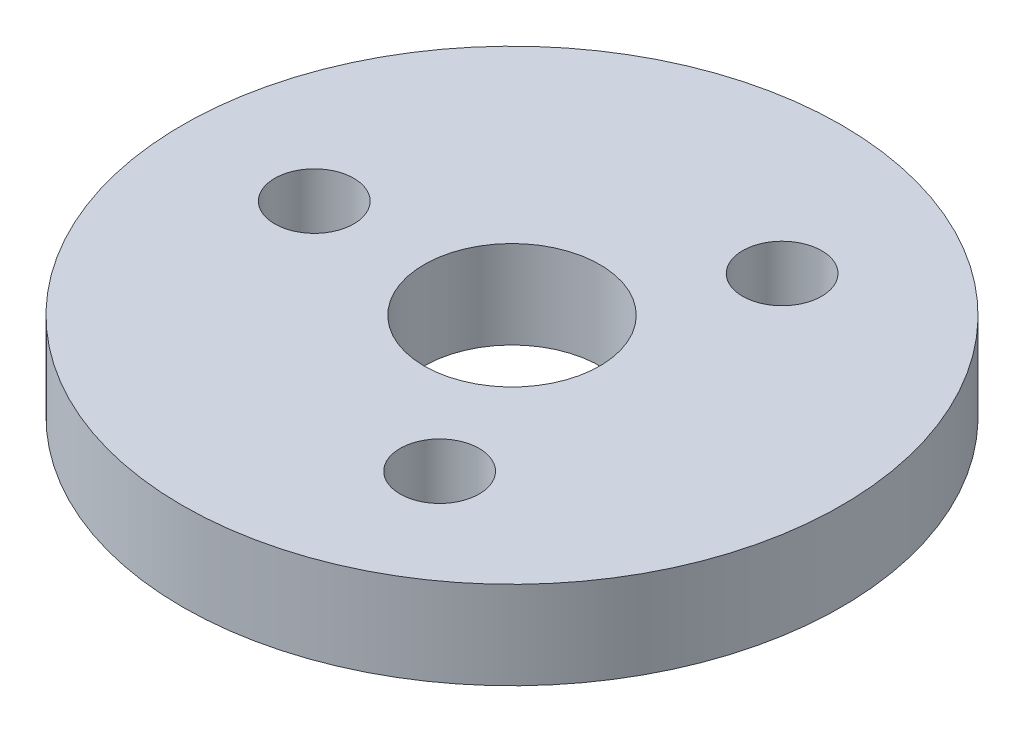
ISO-10303-21;
HEADER;
FILE_DESCRIPTION(('STEP AP214'),'2;1');
FILE_NAME('part.step','',(''),(''),'','','');
FILE_SCHEMA(('AUTOMOTIVE_DESIGN { 1 0 10303 214 1 1 1 1 }'));
ENDSEC;
DATA;
#1=APPLICATION_CONTEXT('core data for automotive mechanical design processes');
#2=APPLICATION_PROTOCOL_DEFINITION('international standard','automotive_design',2000,#1);
#3=PRODUCT_CONTEXT('',#1,'mechanical');
#4=PRODUCT('Part','Part','',(#3));
#5=PRODUCT_RELATED_PRODUCT_CATEGORY('part','',(#4));
#6=PRODUCT_DEFINITION_FORMATION('','',#4);
#7=PRODUCT_DEFINITION_CONTEXT('part definition',#1,'design');
#8=PRODUCT_DEFINITION('design','',#6,#7);
#9=PRODUCT_DEFINITION_SHAPE('','',#8);
#10=(LENGTH_UNIT() NAMED_UNIT(*) SI_UNIT(.MILLI.,.METRE.));
#11=(NAMED_UNIT(*) PLANE_ANGLE_UNIT() SI_UNIT($,.RADIAN.));
#12=(NAMED_UNIT(*) SI_UNIT($,.STERADIAN.) SOLID_ANGLE_UNIT());
#13=UNCERTAINTY_MEASURE_WITH_UNIT(LENGTH_MEASURE(1.E-05),#10,'distance_accuracy_value','');
#14=(GEOMETRIC_REPRESENTATION_CONTEXT(3) GLOBAL_UNCERTAINTY_ASSIGNED_CONTEXT((#13)) GLOBAL_UNIT_ASSIGNED_CONTEXT((#10,
#11,#12)) REPRESENTATION_CONTEXT('',''));
#15=CARTESIAN_POINT('',(0.,0.,0.));
#16=DIRECTION('',(0.,0.,1.));
#17=DIRECTION('',(1.,0.,0.));
#18=AXIS2_PLACEMENT_3D('',#15,#16,#17);
#19=CARTESIAN_POINT('',(0.,4.,0.));
#20=DIRECTION('',(0.,1.,0.));
#21=DIRECTION('',(0.,0.,1.));
#22=AXIS2_PLACEMENT_3D('',#19,#20,#21);
#23=PLANE('',#22);
#24=CARTESIAN_POINT('',(-9.,4.,0.));
#25=DIRECTION('',(0.,1.,0.));
#26=DIRECTION('',(0.,0.,1.));
#27=AXIS2_PLACEMENT_3D('',#24,#25,#26);
#28=CIRCLE('',#27,1.79999999999999);
#29=CARTESIAN_POINT('',(-9.,4.,1.79999999999999));
#30=VERTEX_POINT('',#29);
#31=EDGE_CURVE('E69',#30,#30,#28,.T.);
#32=ORIENTED_EDGE('',*,*,#31,.F.);
#33=EDGE_LOOP('',(#32));
#34=FACE_BOUND('',#33,.T.);
#35=CARTESIAN_POINT('',(4.50000000000004,4.,-7.79422863405993));
#36=DIRECTION('',(0.,1.,0.));
#37=DIRECTION('',(0.,0.,1.));
#38=AXIS2_PLACEMENT_3D('',#35,#36,#37);
#39=CIRCLE('',#38,1.79999999999999);
#40=CARTESIAN_POINT('',(4.50000000000004,4.,-5.99422863405993));
#41=VERTEX_POINT('',#40);
#42=EDGE_CURVE('E66',#41,#41,#39,.T.);
#43=ORIENTED_EDGE('',*,*,#42,.F.);
#44=EDGE_LOOP('',(#43));
#45=FACE_BOUND('',#44,.T.);
#46=CARTESIAN_POINT('',(4.49999999999993,4.,7.79422863405999));
#47=DIRECTION('',(0.,1.,0.));
#48=DIRECTION('',(0.,0.,1.));
#49=AXIS2_PLACEMENT_3D('',#46,#47,#48);
#50=CIRCLE('',#49,1.79999999999999);
#51=CARTESIAN_POINT('',(4.49999999999993,4.,9.59422863405998));
#52=VERTEX_POINT('',#51);
#53=EDGE_CURVE('E60',#52,#52,#50,.T.);
#54=ORIENTED_EDGE('',*,*,#53,.F.);
#55=EDGE_LOOP('',(#54));
#56=FACE_BOUND('',#55,.T.);
#57=CARTESIAN_POINT('',(0.,4.,0.));
#58=DIRECTION('',(0.,1.,0.));
#59=DIRECTION('',(0.,0.,1.));
#60=AXIS2_PLACEMENT_3D('',#57,#58,#59);
#61=CIRCLE('',#60,15.);
#62=CARTESIAN_POINT('',(0.,4.,15.));
#63=VERTEX_POINT('',#62);
#64=EDGE_CURVE('E10',#63,#63,#61,.T.);
#65=ORIENTED_EDGE('',*,*,#64,.T.);
#66=EDGE_LOOP('',(#65));
#67=FACE_BOUND('',#66,.T.);
#68=CARTESIAN_POINT('',(0.,4.,0.));
#69=DIRECTION('',(0.,1.,0.));
#70=DIRECTION('',(0.,0.,1.));
#71=AXIS2_PLACEMENT_3D('',#68,#69,#70);
#72=CIRCLE('',#71,4.);
#73=CARTESIAN_POINT('',(0.,4.,4.));
#74=VERTEX_POINT('',#73);
#75=EDGE_CURVE('E50',#74,#74,#72,.T.);
#76=ORIENTED_EDGE('',*,*,#75,.F.);
#77=EDGE_LOOP('',(#76));
#78=FACE_BOUND('',#77,.T.);
#79=ADVANCED_FACE('F37',(#34,#45,#56,#67,#78),#23,.T.);
#80=CARTESIAN_POINT('',(0.,0.,0.));
#81=DIRECTION('',(0.,1.,0.));
#82=DIRECTION('',(0.,0.,1.));
#83=AXIS2_PLACEMENT_3D('',#80,#81,#82);
#84=PLANE('',#83);
#85=CARTESIAN_POINT('',(-9.,0.,0.));
#86=DIRECTION('',(0.,1.,0.));
#87=DIRECTION('',(0.,0.,1.));
#88=AXIS2_PLACEMENT_3D('',#85,#86,#87);
#89=CIRCLE('',#88,1.79999999999999);
#90=CARTESIAN_POINT('',(-9.,0.,1.79999999999999));
#91=VERTEX_POINT('',#90);
#92=EDGE_CURVE('E41',#91,#91,#89,.T.);
#93=ORIENTED_EDGE('',*,*,#92,.T.);
#94=EDGE_LOOP('',(#93));
#95=FACE_BOUND('',#94,.T.);
#96=CARTESIAN_POINT('',(4.50000000000004,0.,-7.79422863405993));
#97=DIRECTION('',(0.,1.,0.));
#98=DIRECTION('',(0.,0.,1.));
#99=AXIS2_PLACEMENT_3D('',#96,#97,#98);
#100=CIRCLE('',#99,1.79999999999999);
#101=CARTESIAN_POINT('',(4.50000000000004,0.,-5.99422863405993));
#102=VERTEX_POINT('',#101);
#103=EDGE_CURVE('E63',#102,#102,#100,.T.);
#104=ORIENTED_EDGE('',*,*,#103,.T.);
#105=EDGE_LOOP('',(#104));
#106=FACE_BOUND('',#105,.T.);
#107=CARTESIAN_POINT('',(4.49999999999993,0.,7.79422863405999));
#108=DIRECTION('',(0.,1.,0.));
#109=DIRECTION('',(0.,0.,1.));
#110=AXIS2_PLACEMENT_3D('',#107,#108,#109);
#111=CIRCLE('',#110,1.79999999999999);
#112=CARTESIAN_POINT('',(4.49999999999993,0.,9.59422863405998));
#113=VERTEX_POINT('',#112);
#114=EDGE_CURVE('E55',#113,#113,#111,.T.);
#115=ORIENTED_EDGE('',*,*,#114,.T.);
#116=EDGE_LOOP('',(#115));
#117=FACE_BOUND('',#116,.T.);
#118=CARTESIAN_POINT('',(0.,0.,0.));
#119=DIRECTION('',(0.,1.,0.));
#120=DIRECTION('',(0.,0.,1.));
#121=AXIS2_PLACEMENT_3D('',#118,#119,#120);
#122=CIRCLE('',#121,15.);
#123=CARTESIAN_POINT('',(0.,0.,15.));
#124=VERTEX_POINT('',#123);
#125=EDGE_CURVE('E45',#124,#124,#122,.T.);
#126=ORIENTED_EDGE('',*,*,#125,.F.);
#127=EDGE_LOOP('',(#126));
#128=FACE_BOUND('',#127,.T.);
#129=CARTESIAN_POINT('',(0.,0.,0.));
#130=DIRECTION('',(0.,1.,0.));
#131=DIRECTION('',(0.,0.,1.));
#132=AXIS2_PLACEMENT_3D('',#129,#130,#131);
#133=CIRCLE('',#132,4.);
#134=CARTESIAN_POINT('',(0.,0.,4.));
#135=VERTEX_POINT('',#134);
#136=EDGE_CURVE('E52',#135,#135,#133,.T.);
#137=ORIENTED_EDGE('',*,*,#136,.T.);
#138=EDGE_LOOP('',(#137));
#139=FACE_BOUND('',#138,.T.);
#140=ADVANCED_FACE('F76',(#95,#106,#117,#128,#139),#84,.F.);
#141=CARTESIAN_POINT('',(0.,4.,0.));
#142=DIRECTION('',(0.,-1.,0.));
#143=DIRECTION('',(0.,0.,-1.));
#144=AXIS2_PLACEMENT_3D('',#141,#142,#143);
#145=CYLINDRICAL_SURFACE('',#144,15.);
#146=ORIENTED_EDGE('',*,*,#64,.F.);
#147=EDGE_LOOP('',(#146));
#148=FACE_BOUND('',#147,.T.);
#149=ORIENTED_EDGE('',*,*,#125,.T.);
#150=EDGE_LOOP('',(#149));
#151=FACE_BOUND('',#150,.T.);
#152=ADVANCED_FACE('F39',(#148,#151),#145,.T.);
#153=CARTESIAN_POINT('',(0.,4.,0.));
#154=DIRECTION('',(0.,-1.,0.));
#155=DIRECTION('',(0.,0.,-1.));
#156=AXIS2_PLACEMENT_3D('',#153,#154,#155);
#157=CYLINDRICAL_SURFACE('',#156,4.);
#158=ORIENTED_EDGE('',*,*,#75,.T.);
#159=EDGE_LOOP('',(#158));
#160=FACE_BOUND('',#159,.T.);
#161=ORIENTED_EDGE('',*,*,#136,.F.);
#162=EDGE_LOOP('',(#161));
#163=FACE_BOUND('',#162,.T.);
#164=ADVANCED_FACE('F98',(#160,#163),#157,.F.);
#165=CARTESIAN_POINT('',(4.49999999999993,4.,7.79422863405999));
#166=DIRECTION('',(0.,1.,0.));
#167=DIRECTION('',(0.,0.,1.));
#168=AXIS2_PLACEMENT_3D('',#165,#166,#167);
#169=CYLINDRICAL_SURFACE('',#168,1.79999999999999);
#170=ORIENTED_EDGE('',*,*,#53,.T.);
#171=EDGE_LOOP('',(#170));
#172=FACE_BOUND('',#171,.T.);
#173=ORIENTED_EDGE('',*,*,#114,.F.);
#174=EDGE_LOOP('',(#173));
#175=FACE_BOUND('',#174,.T.);
#176=ADVANCED_FACE('F86',(#172,#175),#169,.F.);
#177=CARTESIAN_POINT('',(4.50000000000004,4.,-7.79422863405993));
#178=DIRECTION('',(0.,1.,0.));
#179=DIRECTION('',(0.,0.,1.));
#180=AXIS2_PLACEMENT_3D('',#177,#178,#179);
#181=CYLINDRICAL_SURFACE('',#180,1.79999999999999);
#182=ORIENTED_EDGE('',*,*,#42,.T.);
#183=EDGE_LOOP('',(#182));
#184=FACE_BOUND('',#183,.T.);
#185=ORIENTED_EDGE('',*,*,#103,.F.);
#186=EDGE_LOOP('',(#185));
#187=FACE_BOUND('',#186,.T.);
#188=ADVANCED_FACE('F81',(#184,#187),#181,.F.);
#189=CARTESIAN_POINT('',(-9.,4.,0.));
#190=DIRECTION('',(0.,1.,0.));
#191=DIRECTION('',(0.,0.,1.));
#192=AXIS2_PLACEMENT_3D('',#189,#190,#191);
#193=CYLINDRICAL_SURFACE('',#192,1.79999999999999);
#194=ORIENTED_EDGE('',*,*,#31,.T.);
#195=EDGE_LOOP('',(#194));
#196=FACE_BOUND('',#195,.T.);
#197=ORIENTED_EDGE('',*,*,#92,.F.);
#198=EDGE_LOOP('',(#197));
#199=FACE_BOUND('',#198,.T.);
#200=ADVANCED_FACE('F79',(#196,#199),#193,.F.);
#201=CLOSED_SHELL('',(#79,#140,#152,#164,#176,#188,#200));
#202=MANIFOLD_SOLID_BREP('B2',#201);
#203=ADVANCED_BREP_SHAPE_REPRESENTATION('',(#18,#202),#14);
#204=SHAPE_DEFINITION_REPRESENTATION(#9,#203);
ENDSEC;
END-ISO-10303-21;
